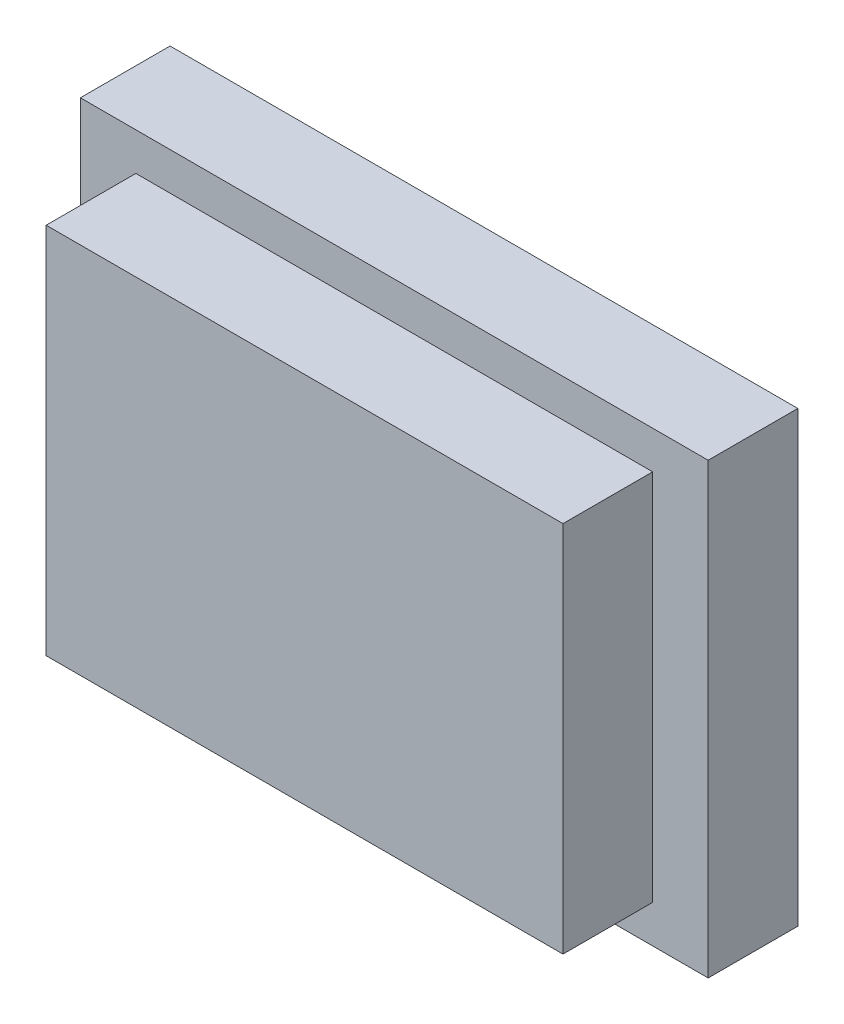
ISO-10303-21;
HEADER;
FILE_DESCRIPTION(('STEP AP214'),'2;1');
FILE_NAME('part.step','',(''),(''),'','','');
FILE_SCHEMA(('AUTOMOTIVE_DESIGN { 1 0 10303 214 1 1 1 1 }'));
ENDSEC;
DATA;
#1=APPLICATION_CONTEXT('core data for automotive mechanical design processes');
#2=APPLICATION_PROTOCOL_DEFINITION('international standard','automotive_design',2000,#1);
#3=PRODUCT_CONTEXT('',#1,'mechanical');
#4=PRODUCT('Part','Part','',(#3));
#5=PRODUCT_RELATED_PRODUCT_CATEGORY('part','',(#4));
#6=PRODUCT_DEFINITION_FORMATION('','',#4);
#7=PRODUCT_DEFINITION_CONTEXT('part definition',#1,'design');
#8=PRODUCT_DEFINITION('design','',#6,#7);
#9=PRODUCT_DEFINITION_SHAPE('','',#8);
#10=(LENGTH_UNIT() NAMED_UNIT(*) SI_UNIT(.MILLI.,.METRE.));
#11=(NAMED_UNIT(*) PLANE_ANGLE_UNIT() SI_UNIT($,.RADIAN.));
#12=(NAMED_UNIT(*) SI_UNIT($,.STERADIAN.) SOLID_ANGLE_UNIT());
#13=UNCERTAINTY_MEASURE_WITH_UNIT(LENGTH_MEASURE(1.E-05),#10,'distance_accuracy_value','');
#14=(GEOMETRIC_REPRESENTATION_CONTEXT(3) GLOBAL_UNCERTAINTY_ASSIGNED_CONTEXT((#13)) GLOBAL_UNIT_ASSIGNED_CONTEXT((#10,
#11,#12)) REPRESENTATION_CONTEXT('',''));
#15=CARTESIAN_POINT('',(0.,0.,0.));
#16=DIRECTION('',(0.,0.,1.));
#17=DIRECTION('',(1.,0.,0.));
#18=AXIS2_PLACEMENT_3D('',#15,#16,#17);
#19=CARTESIAN_POINT('',(0.,0.,3.));
#20=DIRECTION('',(0.,0.,-1.));
#21=DIRECTION('',(-1.,0.,0.));
#22=AXIS2_PLACEMENT_3D('',#19,#20,#21);
#23=PLANE('',#22);
#24=DIRECTION('',(0.,1.,0.));
#25=VECTOR('',#24,1.);
#26=CARTESIAN_POINT('',(10.5,-7.5,3.));
#27=LINE('',#26,#25);
#28=CARTESIAN_POINT('',(10.5,-7.5,3.));
#29=VERTEX_POINT('',#28);
#30=CARTESIAN_POINT('',(10.5,7.5,3.));
#31=VERTEX_POINT('',#30);
#32=EDGE_CURVE('E129',#29,#31,#27,.T.);
#33=ORIENTED_EDGE('',*,*,#32,.T.);
#34=DIRECTION('',(-1.,0.,0.));
#35=VECTOR('',#34,1.);
#36=CARTESIAN_POINT('',(-10.5,7.5,3.));
#37=LINE('',#36,#35);
#38=CARTESIAN_POINT('',(-10.5,7.5,3.));
#39=VERTEX_POINT('',#38);
#40=EDGE_CURVE('E132',#31,#39,#37,.T.);
#41=ORIENTED_EDGE('',*,*,#40,.T.);
#42=DIRECTION('',(0.,-1.,0.));
#43=VECTOR('',#42,1.);
#44=CARTESIAN_POINT('',(-10.5,-7.5,3.));
#45=LINE('',#44,#43);
#46=CARTESIAN_POINT('',(-10.5,-7.5,3.));
#47=VERTEX_POINT('',#46);
#48=EDGE_CURVE('E135',#39,#47,#45,.T.);
#49=ORIENTED_EDGE('',*,*,#48,.T.);
#50=DIRECTION('',(1.,0.,0.));
#51=VECTOR('',#50,1.);
#52=CARTESIAN_POINT('',(-10.5,-7.5,3.));
#53=LINE('',#52,#51);
#54=EDGE_CURVE('E137',#47,#29,#53,.T.);
#55=ORIENTED_EDGE('',*,*,#54,.T.);
#56=EDGE_LOOP('',(#33,#41,#49,#55));
#57=FACE_BOUND('',#56,.T.);
#58=DIRECTION('',(0.,1.,0.));
#59=VECTOR('',#58,1.);
#60=CARTESIAN_POINT('',(8.64420451195258,-6.23628421365652,3.));
#61=LINE('',#60,#59);
#62=CARTESIAN_POINT('',(8.64420451195258,-6.23628421365652,3.));
#63=VERTEX_POINT('',#62);
#64=CARTESIAN_POINT('',(8.64420451195258,6.23628421365652,3.));
#65=VERTEX_POINT('',#64);
#66=EDGE_CURVE('E50',#63,#65,#61,.T.);
#67=ORIENTED_EDGE('',*,*,#66,.F.);
#68=DIRECTION('',(1.,0.,0.));
#69=VECTOR('',#68,1.);
#70=CARTESIAN_POINT('',(-8.64420451195258,-6.23628421365652,3.));
#71=LINE('',#70,#69);
#72=CARTESIAN_POINT('',(-8.64420451195258,-6.23628421365652,3.));
#73=VERTEX_POINT('',#72);
#74=EDGE_CURVE('E54',#73,#63,#71,.T.);
#75=ORIENTED_EDGE('',*,*,#74,.F.);
#76=DIRECTION('',(0.,-1.,0.));
#77=VECTOR('',#76,1.);
#78=CARTESIAN_POINT('',(-8.64420451195258,-6.23628421365652,3.));
#79=LINE('',#78,#77);
#80=CARTESIAN_POINT('',(-8.64420451195258,6.23628421365652,3.));
#81=VERTEX_POINT('',#80);
#82=EDGE_CURVE('E272',#81,#73,#79,.T.);
#83=ORIENTED_EDGE('',*,*,#82,.F.);
#84=DIRECTION('',(-1.,0.,0.));
#85=VECTOR('',#84,1.);
#86=CARTESIAN_POINT('',(-8.64420451195258,6.23628421365652,3.));
#87=LINE('',#86,#85);
#88=EDGE_CURVE('E278',#65,#81,#87,.T.);
#89=ORIENTED_EDGE('',*,*,#88,.F.);
#90=EDGE_LOOP('',(#67,#75,#83,#89));
#91=FACE_BOUND('',#90,.T.);
#92=ADVANCED_FACE('F35',(#57,#91),#23,.F.);
#93=CARTESIAN_POINT('',(10.5,-7.5,3.));
#94=DIRECTION('',(-1.,0.,0.));
#95=DIRECTION('',(0.,0.,1.));
#96=AXIS2_PLACEMENT_3D('',#93,#94,#95);
#97=PLANE('',#96);
#98=DIRECTION('',(0.,1.,0.));
#99=VECTOR('',#98,1.);
#100=CARTESIAN_POINT('',(10.5,-7.5,0.));
#101=LINE('',#100,#99);
#102=CARTESIAN_POINT('',(10.5,-7.5,0.));
#103=VERTEX_POINT('',#102);
#104=CARTESIAN_POINT('',(10.5,7.5,0.));
#105=VERTEX_POINT('',#104);
#106=EDGE_CURVE('E120',#103,#105,#101,.T.);
#107=ORIENTED_EDGE('',*,*,#106,.T.);
#108=DIRECTION('',(0.,0.,-1.));
#109=VECTOR('',#108,1.);
#110=CARTESIAN_POINT('',(10.5,7.5,3.));
#111=LINE('',#110,#109);
#112=EDGE_CURVE('E11',#31,#105,#111,.T.);
#113=ORIENTED_EDGE('',*,*,#112,.F.);
#114=ORIENTED_EDGE('',*,*,#32,.F.);
#115=DIRECTION('',(0.,0.,-1.));
#116=VECTOR('',#115,1.);
#117=CARTESIAN_POINT('',(10.5,-7.5,3.));
#118=LINE('',#117,#116);
#119=EDGE_CURVE('E138',#29,#103,#118,.T.);
#120=ORIENTED_EDGE('',*,*,#119,.T.);
#121=EDGE_LOOP('',(#107,#113,#114,#120));
#122=FACE_BOUND('',#121,.T.);
#123=ADVANCED_FACE('F37',(#122),#97,.F.);
#124=CARTESIAN_POINT('',(-10.5,7.5,3.));
#125=DIRECTION('',(0.,-1.,0.));
#126=DIRECTION('',(0.,0.,-1.));
#127=AXIS2_PLACEMENT_3D('',#124,#125,#126);
#128=PLANE('',#127);
#129=DIRECTION('',(-1.,0.,0.));
#130=VECTOR('',#129,1.);
#131=CARTESIAN_POINT('',(-10.5,7.5,0.));
#132=LINE('',#131,#130);
#133=CARTESIAN_POINT('',(-10.5,7.5,0.));
#134=VERTEX_POINT('',#133);
#135=EDGE_CURVE('E123',#105,#134,#132,.T.);
#136=ORIENTED_EDGE('',*,*,#135,.T.);
#137=DIRECTION('',(0.,0.,-1.));
#138=VECTOR('',#137,1.);
#139=CARTESIAN_POINT('',(-10.5,7.5,3.));
#140=LINE('',#139,#138);
#141=EDGE_CURVE('E43',#39,#134,#140,.T.);
#142=ORIENTED_EDGE('',*,*,#141,.F.);
#143=ORIENTED_EDGE('',*,*,#40,.F.);
#144=ORIENTED_EDGE('',*,*,#112,.T.);
#145=EDGE_LOOP('',(#136,#142,#143,#144));
#146=FACE_BOUND('',#145,.T.);
#147=ADVANCED_FACE('F168',(#146),#128,.F.);
#148=CARTESIAN_POINT('',(-10.5,-7.5,3.));
#149=DIRECTION('',(1.,0.,0.));
#150=DIRECTION('',(0.,0.,-1.));
#151=AXIS2_PLACEMENT_3D('',#148,#149,#150);
#152=PLANE('',#151);
#153=DIRECTION('',(0.,-1.,0.));
#154=VECTOR('',#153,1.);
#155=CARTESIAN_POINT('',(-10.5,-7.5,0.));
#156=LINE('',#155,#154);
#157=CARTESIAN_POINT('',(-10.5,-7.5,0.));
#158=VERTEX_POINT('',#157);
#159=EDGE_CURVE('E141',#134,#158,#156,.T.);
#160=ORIENTED_EDGE('',*,*,#159,.T.);
#161=DIRECTION('',(0.,0.,-1.));
#162=VECTOR('',#161,1.);
#163=CARTESIAN_POINT('',(-10.5,-7.5,3.));
#164=LINE('',#163,#162);
#165=EDGE_CURVE('E146',#47,#158,#164,.T.);
#166=ORIENTED_EDGE('',*,*,#165,.F.);
#167=ORIENTED_EDGE('',*,*,#48,.F.);
#168=ORIENTED_EDGE('',*,*,#141,.T.);
#169=EDGE_LOOP('',(#160,#166,#167,#168));
#170=FACE_BOUND('',#169,.T.);
#171=ADVANCED_FACE('F153',(#170),#152,.F.);
#172=CARTESIAN_POINT('',(-10.5,-7.5,3.));
#173=DIRECTION('',(0.,1.,0.));
#174=DIRECTION('',(0.,0.,1.));
#175=AXIS2_PLACEMENT_3D('',#172,#173,#174);
#176=PLANE('',#175);
#177=DIRECTION('',(1.,0.,0.));
#178=VECTOR('',#177,1.);
#179=CARTESIAN_POINT('',(-10.5,-7.5,0.));
#180=LINE('',#179,#178);
#181=EDGE_CURVE('E133',#158,#103,#180,.T.);
#182=ORIENTED_EDGE('',*,*,#181,.T.);
#183=ORIENTED_EDGE('',*,*,#119,.F.);
#184=ORIENTED_EDGE('',*,*,#54,.F.);
#185=ORIENTED_EDGE('',*,*,#165,.T.);
#186=EDGE_LOOP('',(#182,#183,#184,#185));
#187=FACE_BOUND('',#186,.T.);
#188=ADVANCED_FACE('F162',(#187),#176,.F.);
#189=CARTESIAN_POINT('',(0.,0.,0.));
#190=DIRECTION('',(0.,0.,-1.));
#191=DIRECTION('',(-1.,0.,0.));
#192=AXIS2_PLACEMENT_3D('',#189,#190,#191);
#193=PLANE('',#192);
#194=ORIENTED_EDGE('',*,*,#106,.F.);
#195=ORIENTED_EDGE('',*,*,#181,.F.);
#196=ORIENTED_EDGE('',*,*,#159,.F.);
#197=ORIENTED_EDGE('',*,*,#135,.F.);
#198=EDGE_LOOP('',(#194,#195,#196,#197));
#199=FACE_BOUND('',#198,.T.);
#200=ADVANCED_FACE('F159',(#199),#193,.T.);
#201=CARTESIAN_POINT('',(8.64420451195258,-6.23628421365652,6.));
#202=DIRECTION('',(-1.,0.,0.));
#203=DIRECTION('',(0.,0.,1.));
#204=AXIS2_PLACEMENT_3D('',#201,#202,#203);
#205=PLANE('',#204);
#206=ORIENTED_EDGE('',*,*,#66,.T.);
#207=DIRECTION('',(0.,0.,-1.));
#208=VECTOR('',#207,1.);
#209=CARTESIAN_POINT('',(8.64420451195258,6.23628421365652,6.));
#210=LINE('',#209,#208);
#211=CARTESIAN_POINT('',(8.64420451195258,6.23628421365652,6.));
#212=VERTEX_POINT('',#211);
#213=EDGE_CURVE('E103',#212,#65,#210,.T.);
#214=ORIENTED_EDGE('',*,*,#213,.F.);
#215=DIRECTION('',(0.,1.,0.));
#216=VECTOR('',#215,1.);
#217=CARTESIAN_POINT('',(8.64420451195258,-6.23628421365652,6.));
#218=LINE('',#217,#216);
#219=CARTESIAN_POINT('',(8.64420451195258,-6.23628421365652,6.));
#220=VERTEX_POINT('',#219);
#221=EDGE_CURVE('E109',#220,#212,#218,.T.);
#222=ORIENTED_EDGE('',*,*,#221,.F.);
#223=DIRECTION('',(0.,0.,-1.));
#224=VECTOR('',#223,1.);
#225=CARTESIAN_POINT('',(8.64420451195258,-6.23628421365652,6.));
#226=LINE('',#225,#224);
#227=EDGE_CURVE('E270',#220,#63,#226,.T.);
#228=ORIENTED_EDGE('',*,*,#227,.T.);
#229=EDGE_LOOP('',(#206,#214,#222,#228));
#230=FACE_BOUND('',#229,.T.);
#231=ADVANCED_FACE('F119',(#230),#205,.F.);
#232=CARTESIAN_POINT('',(-8.64420451195258,6.23628421365652,6.));
#233=DIRECTION('',(0.,-1.,0.));
#234=DIRECTION('',(0.,0.,-1.));
#235=AXIS2_PLACEMENT_3D('',#232,#233,#234);
#236=PLANE('',#235);
#237=ORIENTED_EDGE('',*,*,#88,.T.);
#238=DIRECTION('',(0.,0.,-1.));
#239=VECTOR('',#238,1.);
#240=CARTESIAN_POINT('',(-8.64420451195258,6.23628421365652,6.));
#241=LINE('',#240,#239);
#242=CARTESIAN_POINT('',(-8.64420451195258,6.23628421365652,6.));
#243=VERTEX_POINT('',#242);
#244=EDGE_CURVE('E105',#243,#81,#241,.T.);
#245=ORIENTED_EDGE('',*,*,#244,.F.);
#246=DIRECTION('',(-1.,0.,0.));
#247=VECTOR('',#246,1.);
#248=CARTESIAN_POINT('',(-8.64420451195258,6.23628421365652,6.));
#249=LINE('',#248,#247);
#250=EDGE_CURVE('E98',#212,#243,#249,.T.);
#251=ORIENTED_EDGE('',*,*,#250,.F.);
#252=ORIENTED_EDGE('',*,*,#213,.T.);
#253=EDGE_LOOP('',(#237,#245,#251,#252));
#254=FACE_BOUND('',#253,.T.);
#255=ADVANCED_FACE('F101',(#254),#236,.F.);
#256=CARTESIAN_POINT('',(-8.64420451195258,-6.23628421365652,6.));
#257=DIRECTION('',(1.,0.,0.));
#258=DIRECTION('',(0.,0.,-1.));
#259=AXIS2_PLACEMENT_3D('',#256,#257,#258);
#260=PLANE('',#259);
#261=ORIENTED_EDGE('',*,*,#82,.T.);
#262=DIRECTION('',(0.,0.,-1.));
#263=VECTOR('',#262,1.);
#264=CARTESIAN_POINT('',(-8.64420451195258,-6.23628421365652,6.));
#265=LINE('',#264,#263);
#266=CARTESIAN_POINT('',(-8.64420451195258,-6.23628421365652,6.));
#267=VERTEX_POINT('',#266);
#268=EDGE_CURVE('E125',#267,#73,#265,.T.);
#269=ORIENTED_EDGE('',*,*,#268,.F.);
#270=DIRECTION('',(0.,-1.,0.));
#271=VECTOR('',#270,1.);
#272=CARTESIAN_POINT('',(-8.64420451195258,-6.23628421365652,6.));
#273=LINE('',#272,#271);
#274=EDGE_CURVE('E108',#243,#267,#273,.T.);
#275=ORIENTED_EDGE('',*,*,#274,.F.);
#276=ORIENTED_EDGE('',*,*,#244,.T.);
#277=EDGE_LOOP('',(#261,#269,#275,#276));
#278=FACE_BOUND('',#277,.T.);
#279=ADVANCED_FACE('F205',(#278),#260,.F.);
#280=CARTESIAN_POINT('',(-8.64420451195258,-6.23628421365652,6.));
#281=DIRECTION('',(0.,1.,0.));
#282=DIRECTION('',(0.,0.,1.));
#283=AXIS2_PLACEMENT_3D('',#280,#281,#282);
#284=PLANE('',#283);
#285=ORIENTED_EDGE('',*,*,#74,.T.);
#286=ORIENTED_EDGE('',*,*,#227,.F.);
#287=DIRECTION('',(1.,0.,0.));
#288=VECTOR('',#287,1.);
#289=CARTESIAN_POINT('',(-8.64420451195258,-6.23628421365652,6.));
#290=LINE('',#289,#288);
#291=EDGE_CURVE('E114',#267,#220,#290,.T.);
#292=ORIENTED_EDGE('',*,*,#291,.F.);
#293=ORIENTED_EDGE('',*,*,#268,.T.);
#294=EDGE_LOOP('',(#285,#286,#292,#293));
#295=FACE_BOUND('',#294,.T.);
#296=ADVANCED_FACE('F211',(#295),#284,.F.);
#297=CARTESIAN_POINT('',(0.,0.,6.));
#298=DIRECTION('',(0.,0.,-1.));
#299=DIRECTION('',(-1.,0.,0.));
#300=AXIS2_PLACEMENT_3D('',#297,#298,#299);
#301=PLANE('',#300);
#302=ORIENTED_EDGE('',*,*,#221,.T.);
#303=ORIENTED_EDGE('',*,*,#250,.T.);
#304=ORIENTED_EDGE('',*,*,#274,.T.);
#305=ORIENTED_EDGE('',*,*,#291,.T.);
#306=EDGE_LOOP('',(#302,#303,#304,#305));
#307=FACE_BOUND('',#306,.T.);
#308=ADVANCED_FACE('F112',(#307),#301,.F.);
#309=CLOSED_SHELL('',(#92,#123,#147,#171,#188,#200,#231,#255,#279,#296,#308));
#310=MANIFOLD_SOLID_BREP('B2',#309);
#311=ADVANCED_BREP_SHAPE_REPRESENTATION('',(#18,#310),#14);
#312=SHAPE_DEFINITION_REPRESENTATION(#9,#311);
ENDSEC;
END-ISO-10303-21;
